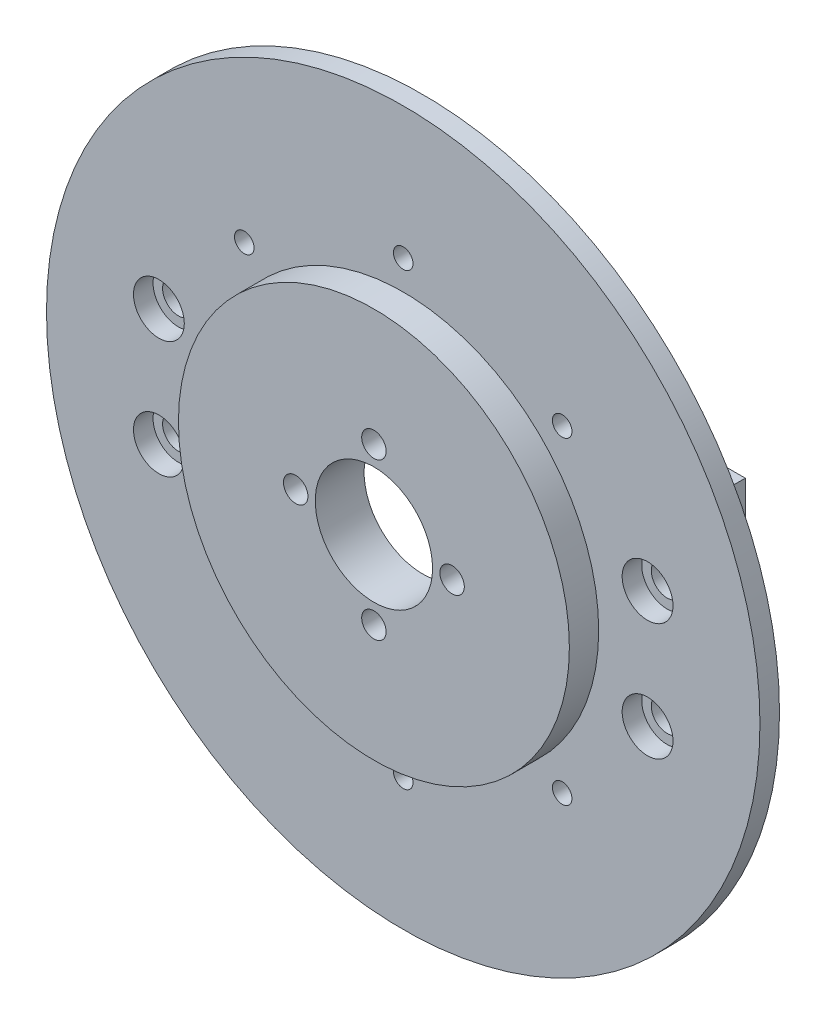
ISO-10303-21;
HEADER;
FILE_DESCRIPTION(('STEP AP214'),'2;1');
FILE_NAME('part.step','',(''),(''),'','','');
FILE_SCHEMA(('AUTOMOTIVE_DESIGN { 1 0 10303 214 1 1 1 1 }'));
ENDSEC;
DATA;
#1=APPLICATION_CONTEXT('core data for automotive mechanical design processes');
#2=APPLICATION_PROTOCOL_DEFINITION('international standard','automotive_design',2000,#1);
#3=PRODUCT_CONTEXT('',#1,'mechanical');
#4=PRODUCT('Part','Part','',(#3));
#5=PRODUCT_RELATED_PRODUCT_CATEGORY('part','',(#4));
#6=PRODUCT_DEFINITION_FORMATION('','',#4);
#7=PRODUCT_DEFINITION_CONTEXT('part definition',#1,'design');
#8=PRODUCT_DEFINITION('design','',#6,#7);
#9=PRODUCT_DEFINITION_SHAPE('','',#8);
#10=(LENGTH_UNIT() NAMED_UNIT(*) SI_UNIT(.MILLI.,.METRE.));
#11=(NAMED_UNIT(*) PLANE_ANGLE_UNIT() SI_UNIT($,.RADIAN.));
#12=(NAMED_UNIT(*) SI_UNIT($,.STERADIAN.) SOLID_ANGLE_UNIT());
#13=UNCERTAINTY_MEASURE_WITH_UNIT(LENGTH_MEASURE(1.E-05),#10,'distance_accuracy_value','');
#14=(GEOMETRIC_REPRESENTATION_CONTEXT(3) GLOBAL_UNCERTAINTY_ASSIGNED_CONTEXT((#13)) GLOBAL_UNIT_ASSIGNED_CONTEXT((#10,
#11,#12)) REPRESENTATION_CONTEXT('',''));
#15=CARTESIAN_POINT('',(0.,0.,0.));
#16=DIRECTION('',(0.,0.,1.));
#17=DIRECTION('',(1.,0.,0.));
#18=AXIS2_PLACEMENT_3D('',#15,#16,#17);
#19=CARTESIAN_POINT('',(0.,0.,0.));
#20=DIRECTION('',(0.,0.,1.));
#21=DIRECTION('',(1.,0.,0.));
#22=AXIS2_PLACEMENT_3D('',#19,#20,#21);
#23=PLANE('',#22);
#24=CARTESIAN_POINT('',(-19.8942699301627,12.0842077999198,0.));
#25=DIRECTION('',(0.,0.,-1.));
#26=DIRECTION('',(-1.,0.,0.));
#27=AXIS2_PLACEMENT_3D('',#24,#25,#26);
#28=CIRCLE('',#27,1.62);
#29=CARTESIAN_POINT('',(-21.5142699301627,12.0842077999198,0.));
#30=VERTEX_POINT('',#29);
#31=EDGE_CURVE('E194',#30,#30,#28,.T.);
#32=ORIENTED_EDGE('',*,*,#31,.F.);
#33=EDGE_LOOP('',(#32));
#34=FACE_BOUND('',#33,.T.);
#35=CARTESIAN_POINT('',(-19.8942699301627,0.0842077999197634,0.));
#36=DIRECTION('',(0.,0.,-1.));
#37=DIRECTION('',(-1.,0.,0.));
#38=AXIS2_PLACEMENT_3D('',#35,#36,#37);
#39=CIRCLE('',#38,1.62);
#40=CARTESIAN_POINT('',(-21.5142699301627,0.0842077999197634,0.));
#41=VERTEX_POINT('',#40);
#42=EDGE_CURVE('E187',#41,#41,#39,.T.);
#43=ORIENTED_EDGE('',*,*,#42,.F.);
#44=EDGE_LOOP('',(#43));
#45=FACE_BOUND('',#44,.T.);
#46=DIRECTION('',(1.,0.,0.));
#47=VECTOR('',#46,1.);
#48=CARTESIAN_POINT('',(-74.8942699301627,-9.91579220008024,0.));
#49=LINE('',#48,#47);
#50=CARTESIAN_POINT('',(-23.6377596918575,-9.91579220008024,0.));
#51=VERTEX_POINT('',#50);
#52=CARTESIAN_POINT('',(-14.8942699301627,-9.91579220008024,0.));
#53=VERTEX_POINT('',#52);
#54=EDGE_CURVE('E156',#51,#53,#49,.T.);
#55=ORIENTED_EDGE('',*,*,#54,.F.);
#56=DIRECTION('',(0.,-1.,0.));
#57=VECTOR('',#56,1.);
#58=CARTESIAN_POINT('',(-23.6377596918575,22.0842077999198,0.));
#59=LINE('',#58,#57);
#60=CARTESIAN_POINT('',(-23.6377596918575,22.0842077999198,0.));
#61=VERTEX_POINT('',#60);
#62=EDGE_CURVE('E122',#61,#51,#59,.T.);
#63=ORIENTED_EDGE('',*,*,#62,.F.);
#64=DIRECTION('',(-1.,0.,0.));
#65=VECTOR('',#64,1.);
#66=CARTESIAN_POINT('',(-74.8942699301627,22.0842077999198,0.));
#67=LINE('',#66,#65);
#68=CARTESIAN_POINT('',(-14.8942699301627,22.0842077999198,0.));
#69=VERTEX_POINT('',#68);
#70=EDGE_CURVE('E145',#69,#61,#67,.T.);
#71=ORIENTED_EDGE('',*,*,#70,.F.);
#72=DIRECTION('',(0.,1.,0.));
#73=VECTOR('',#72,1.);
#74=CARTESIAN_POINT('',(-14.8942699301627,22.0842077999198,0.));
#75=LINE('',#74,#73);
#76=EDGE_CURVE('E74',#53,#69,#75,.T.);
#77=ORIENTED_EDGE('',*,*,#76,.F.);
#78=EDGE_LOOP('',(#55,#63,#71,#77));
#79=FACE_BOUND('',#78,.T.);
#80=ADVANCED_FACE('F39',(#34,#45,#79),#23,.F.);
#81=CARTESIAN_POINT('',(-44.8942699301627,14.0842077999198,-2.));
#82=DIRECTION('',(0.,0.,1.));
#83=DIRECTION('',(1.,0.,0.));
#84=AXIS2_PLACEMENT_3D('',#81,#82,#83);
#85=CYLINDRICAL_SURFACE('',#84,1.25);
#86=CARTESIAN_POINT('',(-44.8942699301627,14.0842077999198,8.));
#87=DIRECTION('',(0.,0.,1.));
#88=DIRECTION('',(1.,0.,0.));
#89=AXIS2_PLACEMENT_3D('',#86,#87,#88);
#90=CIRCLE('',#89,1.25);
#91=CARTESIAN_POINT('',(-43.6442699301627,14.0842077999198,8.));
#92=VERTEX_POINT('',#91);
#93=EDGE_CURVE('E276',#92,#92,#90,.T.);
#94=ORIENTED_EDGE('',*,*,#93,.T.);
#95=EDGE_LOOP('',(#94));
#96=FACE_BOUND('',#95,.T.);
#97=CARTESIAN_POINT('',(-44.8942699301627,14.0842077999198,3.));
#98=DIRECTION('',(0.,0.,-1.));
#99=DIRECTION('',(-1.,0.,0.));
#100=AXIS2_PLACEMENT_3D('',#97,#98,#99);
#101=CIRCLE('',#100,1.25);
#102=CARTESIAN_POINT('',(-46.1442699301627,14.0842077999198,3.));
#103=VERTEX_POINT('',#102);
#104=EDGE_CURVE('E263',#103,#103,#101,.F.);
#105=ORIENTED_EDGE('',*,*,#104,.F.);
#106=EDGE_LOOP('',(#105));
#107=FACE_BOUND('',#106,.T.);
#108=ADVANCED_FACE('F340',(#96,#107),#85,.F.);
#109=CARTESIAN_POINT('',(-36.8942699301627,6.08420779991985,-2.));
#110=DIRECTION('',(0.,0.,1.));
#111=DIRECTION('',(1.,0.,0.));
#112=AXIS2_PLACEMENT_3D('',#109,#110,#111);
#113=CYLINDRICAL_SURFACE('',#112,1.25);
#114=CARTESIAN_POINT('',(-36.8942699301627,6.08420779991985,8.));
#115=DIRECTION('',(0.,0.,1.));
#116=DIRECTION('',(0.,-1.,0.));
#117=AXIS2_PLACEMENT_3D('',#114,#115,#116);
#118=CIRCLE('',#117,1.25);
#119=CARTESIAN_POINT('',(-36.8942699301627,4.83420779991985,8.));
#120=VERTEX_POINT('',#119);
#121=EDGE_CURVE('E265',#120,#120,#118,.T.);
#122=ORIENTED_EDGE('',*,*,#121,.T.);
#123=EDGE_LOOP('',(#122));
#124=FACE_BOUND('',#123,.T.);
#125=CARTESIAN_POINT('',(-36.8942699301627,6.08420779991985,3.));
#126=DIRECTION('',(0.,0.,-1.));
#127=DIRECTION('',(-1.,0.,0.));
#128=AXIS2_PLACEMENT_3D('',#125,#126,#127);
#129=CIRCLE('',#128,1.25);
#130=CARTESIAN_POINT('',(-38.1442699301627,6.08420779991985,3.));
#131=VERTEX_POINT('',#130);
#132=EDGE_CURVE('E260',#131,#131,#129,.F.);
#133=ORIENTED_EDGE('',*,*,#132,.F.);
#134=EDGE_LOOP('',(#133));
#135=FACE_BOUND('',#134,.T.);
#136=ADVANCED_FACE('F346',(#124,#135),#113,.F.);
#137=CARTESIAN_POINT('',(-44.8942699301627,-1.91579220008024,-2.));
#138=DIRECTION('',(0.,0.,1.));
#139=DIRECTION('',(1.,0.,0.));
#140=AXIS2_PLACEMENT_3D('',#137,#138,#139);
#141=CYLINDRICAL_SURFACE('',#140,1.25);
#142=CARTESIAN_POINT('',(-44.8942699301627,-1.91579220008024,8.));
#143=DIRECTION('',(0.,0.,1.));
#144=DIRECTION('',(-1.,0.,0.));
#145=AXIS2_PLACEMENT_3D('',#142,#143,#144);
#146=CIRCLE('',#145,1.25);
#147=CARTESIAN_POINT('',(-46.1442699301627,-1.91579220008024,8.));
#148=VERTEX_POINT('',#147);
#149=EDGE_CURVE('E268',#148,#148,#146,.T.);
#150=ORIENTED_EDGE('',*,*,#149,.T.);
#151=EDGE_LOOP('',(#150));
#152=FACE_BOUND('',#151,.T.);
#153=CARTESIAN_POINT('',(-44.8942699301627,-1.91579220008024,3.));
#154=DIRECTION('',(0.,0.,-1.));
#155=DIRECTION('',(-1.,0.,0.));
#156=AXIS2_PLACEMENT_3D('',#153,#154,#155);
#157=CIRCLE('',#156,1.25);
#158=CARTESIAN_POINT('',(-46.1442699301627,-1.91579220008024,3.));
#159=VERTEX_POINT('',#158);
#160=EDGE_CURVE('E256',#159,#159,#157,.F.);
#161=ORIENTED_EDGE('',*,*,#160,.F.);
#162=EDGE_LOOP('',(#161));
#163=FACE_BOUND('',#162,.T.);
#164=ADVANCED_FACE('F586',(#152,#163),#141,.F.);
#165=CARTESIAN_POINT('',(-52.8942699301627,6.08420779991974,-2.));
#166=DIRECTION('',(0.,0.,1.));
#167=DIRECTION('',(1.,0.,0.));
#168=AXIS2_PLACEMENT_3D('',#165,#166,#167);
#169=CYLINDRICAL_SURFACE('',#168,1.25);
#170=CARTESIAN_POINT('',(-52.8942699301627,6.08420779991974,8.));
#171=DIRECTION('',(0.,0.,1.));
#172=DIRECTION('',(0.,1.,0.));
#173=AXIS2_PLACEMENT_3D('',#170,#171,#172);
#174=CIRCLE('',#173,1.25);
#175=CARTESIAN_POINT('',(-52.8942699301627,7.33420779991973,8.));
#176=VERTEX_POINT('',#175);
#177=EDGE_CURVE('E273',#176,#176,#174,.T.);
#178=ORIENTED_EDGE('',*,*,#177,.T.);
#179=EDGE_LOOP('',(#178));
#180=FACE_BOUND('',#179,.T.);
#181=CARTESIAN_POINT('',(-52.8942699301627,6.08420779991974,3.));
#182=DIRECTION('',(0.,0.,-1.));
#183=DIRECTION('',(-1.,0.,0.));
#184=AXIS2_PLACEMENT_3D('',#181,#182,#183);
#185=CIRCLE('',#184,1.25);
#186=CARTESIAN_POINT('',(-54.1442699301627,6.08420779991974,3.));
#187=VERTEX_POINT('',#186);
#188=EDGE_CURVE('E43',#187,#187,#185,.F.);
#189=ORIENTED_EDGE('',*,*,#188,.F.);
#190=EDGE_LOOP('',(#189));
#191=FACE_BOUND('',#190,.T.);
#192=ADVANCED_FACE('F463',(#180,#191),#169,.F.);
#193=CARTESIAN_POINT('',(-19.8942699301627,12.0842077999198,5.));
#194=DIRECTION('',(0.,0.,-1.));
#195=DIRECTION('',(-1.,0.,0.));
#196=AXIS2_PLACEMENT_3D('',#193,#194,#195);
#197=CYLINDRICAL_SURFACE('',#196,1.62);
#198=ORIENTED_EDGE('',*,*,#31,.T.);
#199=EDGE_LOOP('',(#198));
#200=FACE_BOUND('',#199,.T.);
#201=CARTESIAN_POINT('',(-19.8942699301627,12.0842077999198,3.));
#202=DIRECTION('',(0.,0.,1.));
#203=DIRECTION('',(1.,0.,0.));
#204=AXIS2_PLACEMENT_3D('',#201,#202,#203);
#205=CIRCLE('',#204,1.62);
#206=CARTESIAN_POINT('',(-18.2742699301627,12.0842077999198,3.));
#207=VERTEX_POINT('',#206);
#208=EDGE_CURVE('E176',#207,#207,#205,.F.);
#209=ORIENTED_EDGE('',*,*,#208,.F.);
#210=EDGE_LOOP('',(#209));
#211=FACE_BOUND('',#210,.T.);
#212=ADVANCED_FACE('F452',(#200,#211),#197,.F.);
#213=CARTESIAN_POINT('',(-69.8942699301627,0.0842077999197634,5.));
#214=DIRECTION('',(0.,0.,-1.));
#215=DIRECTION('',(-1.,0.,0.));
#216=AXIS2_PLACEMENT_3D('',#213,#214,#215);
#217=CYLINDRICAL_SURFACE('',#216,1.62);
#218=CARTESIAN_POINT('',(-69.8942699301627,0.0842077999197634,0.));
#219=DIRECTION('',(0.,0.,-1.));
#220=DIRECTION('',(-1.,0.,0.));
#221=AXIS2_PLACEMENT_3D('',#218,#219,#220);
#222=CIRCLE('',#221,1.62);
#223=CARTESIAN_POINT('',(-71.5142699301627,0.0842077999197634,0.));
#224=VERTEX_POINT('',#223);
#225=EDGE_CURVE('E178',#224,#224,#222,.T.);
#226=ORIENTED_EDGE('',*,*,#225,.T.);
#227=EDGE_LOOP('',(#226));
#228=FACE_BOUND('',#227,.T.);
#229=CARTESIAN_POINT('',(-69.8942699301627,0.0842077999197634,3.));
#230=DIRECTION('',(0.,0.,1.));
#231=DIRECTION('',(1.,0.,0.));
#232=AXIS2_PLACEMENT_3D('',#229,#230,#231);
#233=CIRCLE('',#232,1.62);
#234=CARTESIAN_POINT('',(-68.2742699301627,0.0842077999197634,3.));
#235=VERTEX_POINT('',#234);
#236=EDGE_CURVE('E174',#235,#235,#233,.F.);
#237=ORIENTED_EDGE('',*,*,#236,.F.);
#238=EDGE_LOOP('',(#237));
#239=FACE_BOUND('',#238,.T.);
#240=ADVANCED_FACE('F448',(#228,#239),#217,.F.);
#241=CARTESIAN_POINT('',(-69.8942699301627,12.0842077999198,5.));
#242=DIRECTION('',(0.,0.,-1.));
#243=DIRECTION('',(-1.,0.,0.));
#244=AXIS2_PLACEMENT_3D('',#241,#242,#243);
#245=CYLINDRICAL_SURFACE('',#244,1.62);
#246=CARTESIAN_POINT('',(-69.8942699301627,12.0842077999198,0.));
#247=DIRECTION('',(0.,0.,-1.));
#248=DIRECTION('',(-1.,0.,0.));
#249=AXIS2_PLACEMENT_3D('',#246,#247,#248);
#250=CIRCLE('',#249,1.62);
#251=CARTESIAN_POINT('',(-71.5142699301627,12.0842077999198,0.));
#252=VERTEX_POINT('',#251);
#253=EDGE_CURVE('E182',#252,#252,#250,.T.);
#254=ORIENTED_EDGE('',*,*,#253,.T.);
#255=EDGE_LOOP('',(#254));
#256=FACE_BOUND('',#255,.T.);
#257=CARTESIAN_POINT('',(-69.8942699301627,12.0842077999198,3.));
#258=DIRECTION('',(0.,0.,1.));
#259=DIRECTION('',(1.,0.,0.));
#260=AXIS2_PLACEMENT_3D('',#257,#258,#259);
#261=CIRCLE('',#260,1.62);
#262=CARTESIAN_POINT('',(-68.2742699301627,12.0842077999198,3.));
#263=VERTEX_POINT('',#262);
#264=EDGE_CURVE('E170',#263,#263,#261,.F.);
#265=ORIENTED_EDGE('',*,*,#264,.F.);
#266=EDGE_LOOP('',(#265));
#267=FACE_BOUND('',#266,.T.);
#268=ADVANCED_FACE('F451',(#256,#267),#245,.F.);
#269=CARTESIAN_POINT('',(-19.8942699301627,0.0842077999197634,5.));
#270=DIRECTION('',(0.,0.,-1.));
#271=DIRECTION('',(-1.,0.,0.));
#272=AXIS2_PLACEMENT_3D('',#269,#270,#271);
#273=CYLINDRICAL_SURFACE('',#272,1.62);
#274=ORIENTED_EDGE('',*,*,#42,.T.);
#275=EDGE_LOOP('',(#274));
#276=FACE_BOUND('',#275,.T.);
#277=CARTESIAN_POINT('',(-19.8942699301627,0.0842077999197634,3.));
#278=DIRECTION('',(0.,0.,1.));
#279=DIRECTION('',(1.,0.,0.));
#280=AXIS2_PLACEMENT_3D('',#277,#278,#279);
#281=CIRCLE('',#280,1.62);
#282=CARTESIAN_POINT('',(-18.2742699301627,0.0842077999197634,3.));
#283=VERTEX_POINT('',#282);
#284=EDGE_CURVE('E167',#283,#283,#281,.F.);
#285=ORIENTED_EDGE('',*,*,#284,.F.);
#286=EDGE_LOOP('',(#285));
#287=FACE_BOUND('',#286,.T.);
#288=ADVANCED_FACE('F453',(#276,#287),#273,.F.);
#289=CARTESIAN_POINT('',(-61.1577258974533,22.3476637672103,-5.));
#290=DIRECTION('',(0.,0.,1.));
#291=DIRECTION('',(1.,0.,0.));
#292=AXIS2_PLACEMENT_3D('',#289,#290,#291);
#293=CYLINDRICAL_SURFACE('',#292,0.999999999999998);
#294=CARTESIAN_POINT('',(-61.1577258974533,22.3476637672103,5.));
#295=DIRECTION('',(0.,0.,1.));
#296=DIRECTION('',(0.707106781186546,0.707106781186549,0.));
#297=AXIS2_PLACEMENT_3D('',#294,#295,#296);
#298=CIRCLE('',#297,0.999999999999998);
#299=CARTESIAN_POINT('',(-60.4506191162668,23.0547705483969,5.));
#300=VERTEX_POINT('',#299);
#301=EDGE_CURVE('E209',#300,#300,#298,.T.);
#302=ORIENTED_EDGE('',*,*,#301,.T.);
#303=EDGE_LOOP('',(#302));
#304=FACE_BOUND('',#303,.T.);
#305=CARTESIAN_POINT('',(-61.1577258974533,22.3476637672103,3.));
#306=DIRECTION('',(0.,0.,1.));
#307=DIRECTION('',(1.,0.,0.));
#308=AXIS2_PLACEMENT_3D('',#305,#306,#307);
#309=CIRCLE('',#308,0.999999999999998);
#310=CARTESIAN_POINT('',(-60.1577258974533,22.3476637672103,3.));
#311=VERTEX_POINT('',#310);
#312=EDGE_CURVE('E217',#311,#311,#309,.T.);
#313=ORIENTED_EDGE('',*,*,#312,.F.);
#314=EDGE_LOOP('',(#313));
#315=FACE_BOUND('',#314,.T.);
#316=ADVANCED_FACE('F456',(#304,#315),#293,.F.);
#317=CARTESIAN_POINT('',(-28.6308139628723,22.3476637672106,-5.));
#318=DIRECTION('',(0.,0.,1.));
#319=DIRECTION('',(1.,0.,0.));
#320=AXIS2_PLACEMENT_3D('',#317,#318,#319);
#321=CYLINDRICAL_SURFACE('',#320,0.999999999999998);
#322=CARTESIAN_POINT('',(-28.6308139628723,22.3476637672106,5.));
#323=DIRECTION('',(0.,0.,1.));
#324=DIRECTION('',(0.707106781186556,-0.707106781186539,0.));
#325=AXIS2_PLACEMENT_3D('',#322,#323,#324);
#326=CIRCLE('',#325,0.999999999999998);
#327=CARTESIAN_POINT('',(-27.9237071816858,21.640556986024,5.));
#328=VERTEX_POINT('',#327);
#329=EDGE_CURVE('E202',#328,#328,#326,.T.);
#330=ORIENTED_EDGE('',*,*,#329,.T.);
#331=EDGE_LOOP('',(#330));
#332=FACE_BOUND('',#331,.T.);
#333=CARTESIAN_POINT('',(-28.6308139628723,22.3476637672106,3.));
#334=DIRECTION('',(0.,0.,1.));
#335=DIRECTION('',(1.,0.,0.));
#336=AXIS2_PLACEMENT_3D('',#333,#334,#335);
#337=CIRCLE('',#336,0.999999999999998);
#338=CARTESIAN_POINT('',(-27.6308139628723,22.3476637672106,3.));
#339=VERTEX_POINT('',#338);
#340=EDGE_CURVE('E220',#339,#339,#337,.T.);
#341=ORIENTED_EDGE('',*,*,#340,.F.);
#342=EDGE_LOOP('',(#341));
#343=FACE_BOUND('',#342,.T.);
#344=ADVANCED_FACE('F465',(#332,#343),#321,.F.);
#345=CARTESIAN_POINT('',(-28.630813962872,-10.1792481673707,-5.));
#346=DIRECTION('',(0.,0.,1.));
#347=DIRECTION('',(1.,0.,0.));
#348=AXIS2_PLACEMENT_3D('',#345,#346,#347);
#349=CYLINDRICAL_SURFACE('',#348,0.999999999999998);
#350=CARTESIAN_POINT('',(-28.630813962872,-10.1792481673707,5.));
#351=DIRECTION('',(0.,0.,1.));
#352=DIRECTION('',(-0.707106781186541,-0.707106781186554,0.));
#353=AXIS2_PLACEMENT_3D('',#350,#351,#352);
#354=CIRCLE('',#353,0.999999999999998);
#355=CARTESIAN_POINT('',(-29.3379207440585,-10.8863549485572,5.));
#356=VERTEX_POINT('',#355);
#357=EDGE_CURVE('E205',#356,#356,#354,.T.);
#358=ORIENTED_EDGE('',*,*,#357,.T.);
#359=EDGE_LOOP('',(#358));
#360=FACE_BOUND('',#359,.T.);
#361=CARTESIAN_POINT('',(-28.630813962872,-10.1792481673707,3.));
#362=DIRECTION('',(0.,0.,1.));
#363=DIRECTION('',(1.,0.,0.));
#364=AXIS2_PLACEMENT_3D('',#361,#362,#363);
#365=CIRCLE('',#364,0.999999999999998);
#366=CARTESIAN_POINT('',(-27.630813962872,-10.1792481673707,3.));
#367=VERTEX_POINT('',#366);
#368=EDGE_CURVE('E223',#367,#367,#365,.T.);
#369=ORIENTED_EDGE('',*,*,#368,.F.);
#370=EDGE_LOOP('',(#369));
#371=FACE_BOUND('',#370,.T.);
#372=ADVANCED_FACE('F468',(#360,#371),#349,.F.);
#373=CARTESIAN_POINT('',(-61.1577258974532,-10.1792481673709,-5.));
#374=DIRECTION('',(0.,0.,1.));
#375=DIRECTION('',(1.,0.,0.));
#376=AXIS2_PLACEMENT_3D('',#373,#374,#375);
#377=CYLINDRICAL_SURFACE('',#376,0.999999999999998);
#378=CARTESIAN_POINT('',(-61.1577258974532,-10.1792481673709,5.));
#379=DIRECTION('',(0.,0.,1.));
#380=DIRECTION('',(-0.707106781186551,0.707106781186544,0.));
#381=AXIS2_PLACEMENT_3D('',#378,#379,#380);
#382=CIRCLE('',#381,0.999999999999998);
#383=CARTESIAN_POINT('',(-61.8648326786398,-9.47214138618437,5.));
#384=VERTEX_POINT('',#383);
#385=EDGE_CURVE('E206',#384,#384,#382,.T.);
#386=ORIENTED_EDGE('',*,*,#385,.T.);
#387=EDGE_LOOP('',(#386));
#388=FACE_BOUND('',#387,.T.);
#389=CARTESIAN_POINT('',(-61.1577258974532,-10.1792481673709,3.));
#390=DIRECTION('',(0.,0.,1.));
#391=DIRECTION('',(1.,0.,0.));
#392=AXIS2_PLACEMENT_3D('',#389,#390,#391);
#393=CIRCLE('',#392,0.999999999999998);
#394=CARTESIAN_POINT('',(-60.1577258974532,-10.1792481673709,3.));
#395=VERTEX_POINT('',#394);
#396=EDGE_CURVE('E229',#395,#395,#393,.T.);
#397=ORIENTED_EDGE('',*,*,#396,.F.);
#398=EDGE_LOOP('',(#397));
#399=FACE_BOUND('',#398,.T.);
#400=ADVANCED_FACE('F470',(#388,#399),#377,.F.);
#401=CARTESIAN_POINT('',(-74.8942699301627,-9.91579220008024,3.));
#402=DIRECTION('',(0.,1.,0.));
#403=DIRECTION('',(0.,0.,1.));
#404=AXIS2_PLACEMENT_3D('',#401,#402,#403);
#405=PLANE('',#404);
#406=CARTESIAN_POINT('',(-74.8942699301627,-9.91579220008024,0.));
#407=VERTEX_POINT('',#406);
#408=CARTESIAN_POINT('',(-66.150780168468,-9.91579220008024,0.));
#409=VERTEX_POINT('',#408);
#410=EDGE_CURVE('E158',#407,#409,#49,.T.);
#411=ORIENTED_EDGE('',*,*,#410,.T.);
#412=DIRECTION('',(0.,0.,-1.));
#413=VECTOR('',#412,1.);
#414=CARTESIAN_POINT('',(-66.150780168468,-9.91579220008024,3.));
#415=LINE('',#414,#413);
#416=CARTESIAN_POINT('',(-66.150780168468,-9.91579220008024,3.));
#417=VERTEX_POINT('',#416);
#418=EDGE_CURVE('E127',#409,#417,#415,.F.);
#419=ORIENTED_EDGE('',*,*,#418,.T.);
#420=DIRECTION('',(1.,0.,0.));
#421=VECTOR('',#420,1.);
#422=CARTESIAN_POINT('',(-74.8942699301627,-9.91579220008024,3.));
#423=LINE('',#422,#421);
#424=CARTESIAN_POINT('',(-74.8942699301627,-9.91579220008024,3.));
#425=VERTEX_POINT('',#424);
#426=EDGE_CURVE('E86',#425,#417,#423,.T.);
#427=ORIENTED_EDGE('',*,*,#426,.F.);
#428=DIRECTION('',(0.,0.,-1.));
#429=VECTOR('',#428,1.);
#430=CARTESIAN_POINT('',(-74.8942699301627,-9.91579220008024,3.));
#431=LINE('',#430,#429);
#432=EDGE_CURVE('E11',#425,#407,#431,.T.);
#433=ORIENTED_EDGE('',*,*,#432,.T.);
#434=EDGE_LOOP('',(#411,#419,#427,#433));
#435=FACE_BOUND('',#434,.T.);
#436=ADVANCED_FACE('F473',(#435),#405,.F.);
#437=CARTESIAN_POINT('',(-74.8942699301627,22.0842077999198,3.));
#438=DIRECTION('',(0.,-1.,0.));
#439=DIRECTION('',(0.,0.,-1.));
#440=AXIS2_PLACEMENT_3D('',#437,#438,#439);
#441=PLANE('',#440);
#442=ORIENTED_EDGE('',*,*,#70,.T.);
#443=DIRECTION('',(0.,0.,-1.));
#444=VECTOR('',#443,1.);
#445=CARTESIAN_POINT('',(-23.6377596918575,22.0842077999198,3.));
#446=LINE('',#445,#444);
#447=CARTESIAN_POINT('',(-23.6377596918575,22.0842077999198,3.));
#448=VERTEX_POINT('',#447);
#449=EDGE_CURVE('E198',#61,#448,#446,.F.);
#450=ORIENTED_EDGE('',*,*,#449,.T.);
#451=DIRECTION('',(-1.,0.,0.));
#452=VECTOR('',#451,1.);
#453=CARTESIAN_POINT('',(-74.8942699301627,22.0842077999198,3.));
#454=LINE('',#453,#452);
#455=CARTESIAN_POINT('',(-14.8942699301627,22.0842077999198,3.));
#456=VERTEX_POINT('',#455);
#457=EDGE_CURVE('E136',#456,#448,#454,.T.);
#458=ORIENTED_EDGE('',*,*,#457,.F.);
#459=DIRECTION('',(0.,0.,-1.));
#460=VECTOR('',#459,1.);
#461=CARTESIAN_POINT('',(-14.8942699301627,22.0842077999198,3.));
#462=LINE('',#461,#460);
#463=EDGE_CURVE('E58',#456,#69,#462,.T.);
#464=ORIENTED_EDGE('',*,*,#463,.T.);
#465=EDGE_LOOP('',(#442,#450,#458,#464));
#466=FACE_BOUND('',#465,.T.);
#467=ADVANCED_FACE('F360',(#466),#441,.F.);
#468=CARTESIAN_POINT('',(-74.8942699301627,22.0842077999198,3.));
#469=DIRECTION('',(1.,0.,0.));
#470=DIRECTION('',(0.,0.,-1.));
#471=AXIS2_PLACEMENT_3D('',#468,#469,#470);
#472=PLANE('',#471);
#473=DIRECTION('',(0.,-1.,0.));
#474=VECTOR('',#473,1.);
#475=CARTESIAN_POINT('',(-74.8942699301627,22.0842077999198,0.));
#476=LINE('',#475,#474);
#477=CARTESIAN_POINT('',(-74.8942699301627,22.0842077999198,0.));
#478=VERTEX_POINT('',#477);
#479=EDGE_CURVE('E153',#478,#407,#476,.T.);
#480=ORIENTED_EDGE('',*,*,#479,.T.);
#481=ORIENTED_EDGE('',*,*,#432,.F.);
#482=DIRECTION('',(0.,-1.,0.));
#483=VECTOR('',#482,1.);
#484=CARTESIAN_POINT('',(-74.8942699301627,22.0842077999198,3.));
#485=LINE('',#484,#483);
#486=CARTESIAN_POINT('',(-74.8942699301627,22.0842077999198,3.));
#487=VERTEX_POINT('',#486);
#488=EDGE_CURVE('E141',#487,#425,#485,.T.);
#489=ORIENTED_EDGE('',*,*,#488,.F.);
#490=DIRECTION('',(0.,0.,-1.));
#491=VECTOR('',#490,1.);
#492=CARTESIAN_POINT('',(-74.8942699301627,22.0842077999198,3.));
#493=LINE('',#492,#491);
#494=EDGE_CURVE('E152',#487,#478,#493,.T.);
#495=ORIENTED_EDGE('',*,*,#494,.T.);
#496=EDGE_LOOP('',(#480,#481,#489,#495));
#497=FACE_BOUND('',#496,.T.);
#498=ADVANCED_FACE('F41',(#497),#472,.F.);
#499=CARTESIAN_POINT('',(-23.6377596918575,-9.91579220008024,3.));
#500=VERTEX_POINT('',#499);
#501=CARTESIAN_POINT('',(-14.8942699301627,-9.91579220008024,3.));
#502=VERTEX_POINT('',#501);
#503=EDGE_CURVE('E134',#500,#502,#423,.T.);
#504=ORIENTED_EDGE('',*,*,#503,.F.);
#505=DIRECTION('',(0.,0.,-1.));
#506=VECTOR('',#505,1.);
#507=CARTESIAN_POINT('',(-23.6377596918572,-9.91579220008024,3.));
#508=LINE('',#507,#506);
#509=EDGE_CURVE('E116',#500,#51,#508,.T.);
#510=ORIENTED_EDGE('',*,*,#509,.T.);
#511=ORIENTED_EDGE('',*,*,#54,.T.);
#512=DIRECTION('',(0.,0.,-1.));
#513=VECTOR('',#512,1.);
#514=CARTESIAN_POINT('',(-14.8942699301627,-9.91579220008024,3.));
#515=LINE('',#514,#513);
#516=EDGE_CURVE('E49',#502,#53,#515,.T.);
#517=ORIENTED_EDGE('',*,*,#516,.F.);
#518=EDGE_LOOP('',(#504,#510,#511,#517));
#519=FACE_BOUND('',#518,.T.);
#520=ADVANCED_FACE('F140',(#519),#405,.F.);
#521=CARTESIAN_POINT('',(-14.8942699301627,22.0842077999198,3.));
#522=DIRECTION('',(-1.,0.,0.));
#523=DIRECTION('',(0.,-1.,0.));
#524=AXIS2_PLACEMENT_3D('',#521,#522,#523);
#525=PLANE('',#524);
#526=ORIENTED_EDGE('',*,*,#76,.T.);
#527=ORIENTED_EDGE('',*,*,#463,.F.);
#528=DIRECTION('',(0.,1.,0.));
#529=VECTOR('',#528,1.);
#530=CARTESIAN_POINT('',(-14.8942699301627,22.0842077999198,3.));
#531=LINE('',#530,#529);
#532=EDGE_CURVE('E143',#502,#456,#531,.T.);
#533=ORIENTED_EDGE('',*,*,#532,.F.);
#534=ORIENTED_EDGE('',*,*,#516,.T.);
#535=EDGE_LOOP('',(#526,#527,#533,#534));
#536=FACE_BOUND('',#535,.T.);
#537=ADVANCED_FACE('F359',(#536),#525,.F.);
#538=CARTESIAN_POINT('',(-66.1507801684681,22.0842077999198,3.));
#539=VERTEX_POINT('',#538);
#540=EDGE_CURVE('E150',#539,#487,#454,.T.);
#541=ORIENTED_EDGE('',*,*,#540,.F.);
#542=DIRECTION('',(0.,0.,-1.));
#543=VECTOR('',#542,1.);
#544=CARTESIAN_POINT('',(-66.1507801684681,22.0842077999198,3.));
#545=LINE('',#544,#543);
#546=CARTESIAN_POINT('',(-66.150780168468,22.0842077999198,0.));
#547=VERTEX_POINT('',#546);
#548=EDGE_CURVE('E126',#539,#547,#545,.T.);
#549=ORIENTED_EDGE('',*,*,#548,.T.);
#550=EDGE_CURVE('E80',#547,#478,#67,.T.);
#551=ORIENTED_EDGE('',*,*,#550,.T.);
#552=ORIENTED_EDGE('',*,*,#494,.F.);
#553=EDGE_LOOP('',(#541,#549,#551,#552));
#554=FACE_BOUND('',#553,.T.);
#555=ADVANCED_FACE('F353',(#554),#441,.F.);
#556=ORIENTED_EDGE('',*,*,#253,.F.);
#557=EDGE_LOOP('',(#556));
#558=FACE_BOUND('',#557,.T.);
#559=ORIENTED_EDGE('',*,*,#225,.F.);
#560=EDGE_LOOP('',(#559));
#561=FACE_BOUND('',#560,.T.);
#562=ORIENTED_EDGE('',*,*,#550,.F.);
#563=DIRECTION('',(0.,1.,0.));
#564=VECTOR('',#563,1.);
#565=CARTESIAN_POINT('',(-66.150780168468,22.0842077999198,0.));
#566=LINE('',#565,#564);
#567=EDGE_CURVE('E138',#409,#547,#566,.T.);
#568=ORIENTED_EDGE('',*,*,#567,.F.);
#569=ORIENTED_EDGE('',*,*,#410,.F.);
#570=ORIENTED_EDGE('',*,*,#479,.F.);
#571=EDGE_LOOP('',(#562,#568,#569,#570));
#572=FACE_BOUND('',#571,.T.);
#573=ADVANCED_FACE('F247',(#558,#561,#572),#23,.F.);
#574=CARTESIAN_POINT('',(-44.8942699301627,6.08420779991976,3.));
#575=DIRECTION('',(0.,0.,1.));
#576=DIRECTION('',(1.,0.,0.));
#577=AXIS2_PLACEMENT_3D('',#574,#575,#576);
#578=PLANE('',#577);
#579=CARTESIAN_POINT('',(-44.8942699301627,6.08420779991976,3.));
#580=DIRECTION('',(0.,0.,1.));
#581=DIRECTION('',(1.,0.,0.));
#582=AXIS2_PLACEMENT_3D('',#579,#580,#581);
#583=CIRCLE('',#582,6.);
#584=CARTESIAN_POINT('',(-38.8942699301627,6.08420779991976,3.));
#585=VERTEX_POINT('',#584);
#586=EDGE_CURVE('E376',#585,#585,#583,.T.);
#587=ORIENTED_EDGE('',*,*,#586,.T.);
#588=EDGE_LOOP('',(#587));
#589=FACE_BOUND('',#588,.T.);
#590=ORIENTED_EDGE('',*,*,#340,.T.);
#591=EDGE_LOOP('',(#590));
#592=FACE_BOUND('',#591,.T.);
#593=ORIENTED_EDGE('',*,*,#312,.T.);
#594=EDGE_LOOP('',(#593));
#595=FACE_BOUND('',#594,.T.);
#596=DIRECTION('',(0.,1.,0.));
#597=VECTOR('',#596,1.);
#598=CARTESIAN_POINT('',(-66.150780168468,22.0842077999198,3.));
#599=LINE('',#598,#597);
#600=EDGE_CURVE('E137',#417,#539,#599,.T.);
#601=ORIENTED_EDGE('',*,*,#600,.T.);
#602=ORIENTED_EDGE('',*,*,#540,.T.);
#603=ORIENTED_EDGE('',*,*,#488,.T.);
#604=ORIENTED_EDGE('',*,*,#426,.T.);
#605=EDGE_LOOP('',(#601,#602,#603,#604));
#606=FACE_BOUND('',#605,.T.);
#607=ORIENTED_EDGE('',*,*,#396,.T.);
#608=EDGE_LOOP('',(#607));
#609=FACE_BOUND('',#608,.T.);
#610=ORIENTED_EDGE('',*,*,#368,.T.);
#611=EDGE_LOOP('',(#610));
#612=FACE_BOUND('',#611,.T.);
#613=ORIENTED_EDGE('',*,*,#457,.T.);
#614=DIRECTION('',(0.,-1.,0.));
#615=VECTOR('',#614,1.);
#616=CARTESIAN_POINT('',(-23.6377596918575,22.0842077999198,3.));
#617=LINE('',#616,#615);
#618=EDGE_CURVE('E119',#448,#500,#617,.T.);
#619=ORIENTED_EDGE('',*,*,#618,.T.);
#620=ORIENTED_EDGE('',*,*,#503,.T.);
#621=ORIENTED_EDGE('',*,*,#532,.T.);
#622=EDGE_LOOP('',(#613,#619,#620,#621));
#623=FACE_BOUND('',#622,.T.);
#624=CARTESIAN_POINT('',(-44.8942699301627,-16.9157922000802,3.));
#625=DIRECTION('',(0.,0.,1.));
#626=DIRECTION('',(1.,0.,0.));
#627=AXIS2_PLACEMENT_3D('',#624,#625,#626);
#628=CIRCLE('',#627,0.999999999999998);
#629=CARTESIAN_POINT('',(-43.8942699301627,-16.9157922000802,3.));
#630=VERTEX_POINT('',#629);
#631=EDGE_CURVE('E226',#630,#630,#628,.T.);
#632=ORIENTED_EDGE('',*,*,#631,.T.);
#633=EDGE_LOOP('',(#632));
#634=FACE_BOUND('',#633,.T.);
#635=CARTESIAN_POINT('',(-44.8942699301627,29.0842077999198,3.));
#636=DIRECTION('',(0.,0.,1.));
#637=DIRECTION('',(1.,0.,0.));
#638=AXIS2_PLACEMENT_3D('',#635,#636,#637);
#639=CIRCLE('',#638,0.999999999999998);
#640=CARTESIAN_POINT('',(-43.8942699301627,29.0842077999198,3.));
#641=VERTEX_POINT('',#640);
#642=EDGE_CURVE('E235',#641,#641,#639,.T.);
#643=ORIENTED_EDGE('',*,*,#642,.T.);
#644=EDGE_LOOP('',(#643));
#645=FACE_BOUND('',#644,.T.);
#646=CARTESIAN_POINT('',(-44.8942699301627,6.08420779991976,3.));
#647=DIRECTION('',(0.,0.,1.));
#648=DIRECTION('',(1.,0.,0.));
#649=AXIS2_PLACEMENT_3D('',#646,#647,#648);
#650=CIRCLE('',#649,36.5);
#651=CARTESIAN_POINT('',(-8.39426993016271,6.08420779991976,3.));
#652=VERTEX_POINT('',#651);
#653=EDGE_CURVE('E238',#652,#652,#650,.T.);
#654=ORIENTED_EDGE('',*,*,#653,.F.);
#655=EDGE_LOOP('',(#654));
#656=FACE_BOUND('',#655,.T.);
#657=ORIENTED_EDGE('',*,*,#188,.T.);
#658=EDGE_LOOP('',(#657));
#659=FACE_BOUND('',#658,.T.);
#660=ORIENTED_EDGE('',*,*,#160,.T.);
#661=EDGE_LOOP('',(#660));
#662=FACE_BOUND('',#661,.T.);
#663=ORIENTED_EDGE('',*,*,#132,.T.);
#664=EDGE_LOOP('',(#663));
#665=FACE_BOUND('',#664,.T.);
#666=ORIENTED_EDGE('',*,*,#104,.T.);
#667=EDGE_LOOP('',(#666));
#668=FACE_BOUND('',#667,.T.);
#669=ADVANCED_FACE('F131',(#589,#592,#595,#606,#609,#612,#623,#634,#645,#656,#659,#662,#665,
#668),#578,.F.);
#670=CARTESIAN_POINT('',(-44.8942699301627,6.08420779991976,5.));
#671=DIRECTION('',(0.,0.,-1.));
#672=DIRECTION('',(-1.,0.,0.));
#673=AXIS2_PLACEMENT_3D('',#670,#671,#672);
#674=CYLINDRICAL_SURFACE('',#673,36.5);
#675=CARTESIAN_POINT('',(-44.8942699301627,6.08420779991976,5.));
#676=DIRECTION('',(0.,0.,1.));
#677=DIRECTION('',(1.,0.,0.));
#678=AXIS2_PLACEMENT_3D('',#675,#676,#677);
#679=CIRCLE('',#678,36.5);
#680=CARTESIAN_POINT('',(-8.39426993016271,6.08420779991976,5.));
#681=VERTEX_POINT('',#680);
#682=EDGE_CURVE('E157',#681,#681,#679,.T.);
#683=ORIENTED_EDGE('',*,*,#682,.F.);
#684=EDGE_LOOP('',(#683));
#685=FACE_BOUND('',#684,.T.);
#686=ORIENTED_EDGE('',*,*,#653,.T.);
#687=EDGE_LOOP('',(#686));
#688=FACE_BOUND('',#687,.T.);
#689=ADVANCED_FACE('F243',(#685,#688),#674,.T.);
#690=CARTESIAN_POINT('',(-44.8942699301627,6.08420779991976,5.));
#691=DIRECTION('',(0.,0.,1.));
#692=DIRECTION('',(1.,0.,0.));
#693=AXIS2_PLACEMENT_3D('',#690,#691,#692);
#694=PLANE('',#693);
#695=CARTESIAN_POINT('',(-44.8942699301627,6.08420779991976,5.));
#696=DIRECTION('',(0.,0.,1.));
#697=DIRECTION('',(1.,0.,0.));
#698=AXIS2_PLACEMENT_3D('',#695,#696,#697);
#699=CIRCLE('',#698,20.);
#700=CARTESIAN_POINT('',(-24.8942699301627,6.08420779991976,5.));
#701=VERTEX_POINT('',#700);
#702=EDGE_CURVE('E281',#701,#701,#699,.T.);
#703=ORIENTED_EDGE('',*,*,#702,.F.);
#704=EDGE_LOOP('',(#703));
#705=FACE_BOUND('',#704,.T.);
#706=CARTESIAN_POINT('',(-69.8942699301627,0.0842077999197634,5.));
#707=DIRECTION('',(0.,0.,1.));
#708=DIRECTION('',(1.,0.,0.));
#709=AXIS2_PLACEMENT_3D('',#706,#707,#708);
#710=CIRCLE('',#709,2.6);
#711=CARTESIAN_POINT('',(-67.2942699301627,0.0842077999197634,5.));
#712=VERTEX_POINT('',#711);
#713=EDGE_CURVE('E294',#712,#712,#710,.T.);
#714=ORIENTED_EDGE('',*,*,#713,.F.);
#715=EDGE_LOOP('',(#714));
#716=FACE_BOUND('',#715,.T.);
#717=CARTESIAN_POINT('',(-19.8942699301627,12.0842077999198,5.));
#718=DIRECTION('',(0.,0.,1.));
#719=DIRECTION('',(1.,0.,0.));
#720=AXIS2_PLACEMENT_3D('',#717,#718,#719);
#721=CIRCLE('',#720,2.6);
#722=CARTESIAN_POINT('',(-17.2942699301627,12.0842077999198,5.));
#723=VERTEX_POINT('',#722);
#724=EDGE_CURVE('E300',#723,#723,#721,.T.);
#725=ORIENTED_EDGE('',*,*,#724,.F.);
#726=EDGE_LOOP('',(#725));
#727=FACE_BOUND('',#726,.T.);
#728=CARTESIAN_POINT('',(-19.8942699301627,0.0842077999197634,5.));
#729=DIRECTION('',(0.,0.,1.));
#730=DIRECTION('',(1.,0.,0.));
#731=AXIS2_PLACEMENT_3D('',#728,#729,#730);
#732=CIRCLE('',#731,2.6);
#733=CARTESIAN_POINT('',(-17.2942699301627,0.0842077999197634,5.));
#734=VERTEX_POINT('',#733);
#735=EDGE_CURVE('E288',#734,#734,#732,.T.);
#736=ORIENTED_EDGE('',*,*,#735,.F.);
#737=EDGE_LOOP('',(#736));
#738=FACE_BOUND('',#737,.T.);
#739=CARTESIAN_POINT('',(-69.8942699301627,12.0842077999198,5.));
#740=DIRECTION('',(0.,0.,1.));
#741=DIRECTION('',(1.,0.,0.));
#742=AXIS2_PLACEMENT_3D('',#739,#740,#741);
#743=CIRCLE('',#742,2.6);
#744=CARTESIAN_POINT('',(-67.2942699301627,12.0842077999198,5.));
#745=VERTEX_POINT('',#744);
#746=EDGE_CURVE('E191',#745,#745,#743,.T.);
#747=ORIENTED_EDGE('',*,*,#746,.F.);
#748=EDGE_LOOP('',(#747));
#749=FACE_BOUND('',#748,.T.);
#750=ORIENTED_EDGE('',*,*,#385,.F.);
#751=EDGE_LOOP('',(#750));
#752=FACE_BOUND('',#751,.T.);
#753=CARTESIAN_POINT('',(-44.8942699301627,-16.9157922000802,5.));
#754=DIRECTION('',(0.,0.,1.));
#755=DIRECTION('',(-1.,0.,0.));
#756=AXIS2_PLACEMENT_3D('',#753,#754,#755);
#757=CIRCLE('',#756,0.999999999999998);
#758=CARTESIAN_POINT('',(-45.8942699301627,-16.9157922000802,5.));
#759=VERTEX_POINT('',#758);
#760=EDGE_CURVE('E210',#759,#759,#757,.T.);
#761=ORIENTED_EDGE('',*,*,#760,.F.);
#762=EDGE_LOOP('',(#761));
#763=FACE_BOUND('',#762,.T.);
#764=ORIENTED_EDGE('',*,*,#357,.F.);
#765=EDGE_LOOP('',(#764));
#766=FACE_BOUND('',#765,.T.);
#767=ORIENTED_EDGE('',*,*,#329,.F.);
#768=EDGE_LOOP('',(#767));
#769=FACE_BOUND('',#768,.T.);
#770=ORIENTED_EDGE('',*,*,#301,.F.);
#771=EDGE_LOOP('',(#770));
#772=FACE_BOUND('',#771,.T.);
#773=CARTESIAN_POINT('',(-44.8942699301627,29.0842077999198,5.));
#774=DIRECTION('',(0.,0.,1.));
#775=DIRECTION('',(1.,0.,0.));
#776=AXIS2_PLACEMENT_3D('',#773,#774,#775);
#777=CIRCLE('',#776,0.999999999999998);
#778=CARTESIAN_POINT('',(-43.8942699301627,29.0842077999198,5.));
#779=VERTEX_POINT('',#778);
#780=EDGE_CURVE('E232',#779,#779,#777,.T.);
#781=ORIENTED_EDGE('',*,*,#780,.F.);
#782=EDGE_LOOP('',(#781));
#783=FACE_BOUND('',#782,.T.);
#784=ORIENTED_EDGE('',*,*,#682,.T.);
#785=EDGE_LOOP('',(#784));
#786=FACE_BOUND('',#785,.T.);
#787=ADVANCED_FACE('F312',(#705,#716,#727,#738,#749,#752,#763,#766,#769,#772,#783,#786),#694,.T.);
#788=CARTESIAN_POINT('',(-44.8942699301627,29.0842077999198,-5.));
#789=DIRECTION('',(0.,0.,1.));
#790=DIRECTION('',(1.,0.,0.));
#791=AXIS2_PLACEMENT_3D('',#788,#789,#790);
#792=CYLINDRICAL_SURFACE('',#791,0.999999999999998);
#793=ORIENTED_EDGE('',*,*,#780,.T.);
#794=EDGE_LOOP('',(#793));
#795=FACE_BOUND('',#794,.T.);
#796=ORIENTED_EDGE('',*,*,#642,.F.);
#797=EDGE_LOOP('',(#796));
#798=FACE_BOUND('',#797,.T.);
#799=ADVANCED_FACE('F315',(#795,#798),#792,.F.);
#800=CARTESIAN_POINT('',(-44.8942699301627,-16.9157922000802,-5.));
#801=DIRECTION('',(0.,0.,1.));
#802=DIRECTION('',(1.,0.,0.));
#803=AXIS2_PLACEMENT_3D('',#800,#801,#802);
#804=CYLINDRICAL_SURFACE('',#803,0.999999999999998);
#805=ORIENTED_EDGE('',*,*,#760,.T.);
#806=EDGE_LOOP('',(#805));
#807=FACE_BOUND('',#806,.T.);
#808=ORIENTED_EDGE('',*,*,#631,.F.);
#809=EDGE_LOOP('',(#808));
#810=FACE_BOUND('',#809,.T.);
#811=ADVANCED_FACE('F425',(#807,#810),#804,.F.);
#812=CARTESIAN_POINT('',(-19.8942699301627,0.0842077999197634,3.));
#813=DIRECTION('',(0.,0.,1.));
#814=DIRECTION('',(1.,0.,0.));
#815=AXIS2_PLACEMENT_3D('',#812,#813,#814);
#816=PLANE('',#815);
#817=CARTESIAN_POINT('',(-19.8942699301627,0.0842077999197634,3.));
#818=DIRECTION('',(0.,0.,1.));
#819=DIRECTION('',(1.,0.,0.));
#820=AXIS2_PLACEMENT_3D('',#817,#818,#819);
#821=CIRCLE('',#820,2.6);
#822=CARTESIAN_POINT('',(-17.2942699301627,0.0842077999197634,3.));
#823=VERTEX_POINT('',#822);
#824=EDGE_CURVE('E285',#823,#823,#821,.T.);
#825=ORIENTED_EDGE('',*,*,#824,.T.);
#826=EDGE_LOOP('',(#825));
#827=FACE_BOUND('',#826,.T.);
#828=ORIENTED_EDGE('',*,*,#284,.T.);
#829=EDGE_LOOP('',(#828));
#830=FACE_BOUND('',#829,.T.);
#831=ADVANCED_FACE('F417',(#827,#830),#816,.T.);
#832=CARTESIAN_POINT('',(-19.8942699301627,0.0842077999197634,3.));
#833=DIRECTION('',(0.,0.,1.));
#834=DIRECTION('',(1.,0.,0.));
#835=AXIS2_PLACEMENT_3D('',#832,#833,#834);
#836=CYLINDRICAL_SURFACE('',#835,2.6);
#837=ORIENTED_EDGE('',*,*,#824,.F.);
#838=EDGE_LOOP('',(#837));
#839=FACE_BOUND('',#838,.T.);
#840=ORIENTED_EDGE('',*,*,#735,.T.);
#841=EDGE_LOOP('',(#840));
#842=FACE_BOUND('',#841,.T.);
#843=ADVANCED_FACE('F414',(#839,#842),#836,.F.);
#844=CARTESIAN_POINT('',(-69.8942699301627,12.0842077999198,3.));
#845=DIRECTION('',(0.,0.,1.));
#846=DIRECTION('',(1.,0.,0.));
#847=AXIS2_PLACEMENT_3D('',#844,#845,#846);
#848=PLANE('',#847);
#849=CARTESIAN_POINT('',(-69.8942699301627,12.0842077999198,3.));
#850=DIRECTION('',(0.,0.,1.));
#851=DIRECTION('',(1.,0.,0.));
#852=AXIS2_PLACEMENT_3D('',#849,#850,#851);
#853=CIRCLE('',#852,2.6);
#854=CARTESIAN_POINT('',(-67.2942699301627,12.0842077999198,3.));
#855=VERTEX_POINT('',#854);
#856=EDGE_CURVE('E171',#855,#855,#853,.T.);
#857=ORIENTED_EDGE('',*,*,#856,.T.);
#858=EDGE_LOOP('',(#857));
#859=FACE_BOUND('',#858,.T.);
#860=ORIENTED_EDGE('',*,*,#264,.T.);
#861=EDGE_LOOP('',(#860));
#862=FACE_BOUND('',#861,.T.);
#863=ADVANCED_FACE('F416',(#859,#862),#848,.T.);
#864=CARTESIAN_POINT('',(-69.8942699301627,12.0842077999198,3.));
#865=DIRECTION('',(0.,0.,1.));
#866=DIRECTION('',(1.,0.,0.));
#867=AXIS2_PLACEMENT_3D('',#864,#865,#866);
#868=CYLINDRICAL_SURFACE('',#867,2.6);
#869=ORIENTED_EDGE('',*,*,#856,.F.);
#870=EDGE_LOOP('',(#869));
#871=FACE_BOUND('',#870,.T.);
#872=ORIENTED_EDGE('',*,*,#746,.T.);
#873=EDGE_LOOP('',(#872));
#874=FACE_BOUND('',#873,.T.);
#875=ADVANCED_FACE('F310',(#871,#874),#868,.F.);
#876=CARTESIAN_POINT('',(-69.8942699301627,0.0842077999197634,3.));
#877=DIRECTION('',(0.,0.,1.));
#878=DIRECTION('',(1.,0.,0.));
#879=AXIS2_PLACEMENT_3D('',#876,#877,#878);
#880=PLANE('',#879);
#881=CARTESIAN_POINT('',(-69.8942699301627,0.0842077999197634,3.));
#882=DIRECTION('',(0.,0.,1.));
#883=DIRECTION('',(1.,0.,0.));
#884=AXIS2_PLACEMENT_3D('',#881,#882,#883);
#885=CIRCLE('',#884,2.6);
#886=CARTESIAN_POINT('',(-67.2942699301627,0.0842077999197634,3.));
#887=VERTEX_POINT('',#886);
#888=EDGE_CURVE('E297',#887,#887,#885,.T.);
#889=ORIENTED_EDGE('',*,*,#888,.T.);
#890=EDGE_LOOP('',(#889));
#891=FACE_BOUND('',#890,.T.);
#892=ORIENTED_EDGE('',*,*,#236,.T.);
#893=EDGE_LOOP('',(#892));
#894=FACE_BOUND('',#893,.T.);
#895=ADVANCED_FACE('F434',(#891,#894),#880,.T.);
#896=CARTESIAN_POINT('',(-69.8942699301627,0.0842077999197634,3.));
#897=DIRECTION('',(0.,0.,1.));
#898=DIRECTION('',(1.,0.,0.));
#899=AXIS2_PLACEMENT_3D('',#896,#897,#898);
#900=CYLINDRICAL_SURFACE('',#899,2.6);
#901=ORIENTED_EDGE('',*,*,#888,.F.);
#902=EDGE_LOOP('',(#901));
#903=FACE_BOUND('',#902,.T.);
#904=ORIENTED_EDGE('',*,*,#713,.T.);
#905=EDGE_LOOP('',(#904));
#906=FACE_BOUND('',#905,.T.);
#907=ADVANCED_FACE('F430',(#903,#906),#900,.F.);
#908=CARTESIAN_POINT('',(-19.8942699301627,12.0842077999198,3.));
#909=DIRECTION('',(0.,0.,1.));
#910=DIRECTION('',(1.,0.,0.));
#911=AXIS2_PLACEMENT_3D('',#908,#909,#910);
#912=PLANE('',#911);
#913=CARTESIAN_POINT('',(-19.8942699301627,12.0842077999198,3.));
#914=DIRECTION('',(0.,0.,1.));
#915=DIRECTION('',(1.,0.,0.));
#916=AXIS2_PLACEMENT_3D('',#913,#914,#915);
#917=CIRCLE('',#916,2.6);
#918=CARTESIAN_POINT('',(-17.2942699301627,12.0842077999198,3.));
#919=VERTEX_POINT('',#918);
#920=EDGE_CURVE('E291',#919,#919,#917,.T.);
#921=ORIENTED_EDGE('',*,*,#920,.T.);
#922=EDGE_LOOP('',(#921));
#923=FACE_BOUND('',#922,.T.);
#924=ORIENTED_EDGE('',*,*,#208,.T.);
#925=EDGE_LOOP('',(#924));
#926=FACE_BOUND('',#925,.T.);
#927=ADVANCED_FACE('F433',(#923,#926),#912,.T.);
#928=CARTESIAN_POINT('',(-19.8942699301627,12.0842077999198,3.));
#929=DIRECTION('',(0.,0.,1.));
#930=DIRECTION('',(1.,0.,0.));
#931=AXIS2_PLACEMENT_3D('',#928,#929,#930);
#932=CYLINDRICAL_SURFACE('',#931,2.6);
#933=ORIENTED_EDGE('',*,*,#920,.F.);
#934=EDGE_LOOP('',(#933));
#935=FACE_BOUND('',#934,.T.);
#936=ORIENTED_EDGE('',*,*,#724,.T.);
#937=EDGE_LOOP('',(#936));
#938=FACE_BOUND('',#937,.T.);
#939=ADVANCED_FACE('F404',(#935,#938),#932,.F.);
#940=CARTESIAN_POINT('',(-44.8942699301627,6.08420779991976,8.));
#941=DIRECTION('',(0.,0.,-1.));
#942=DIRECTION('',(-1.,0.,0.));
#943=AXIS2_PLACEMENT_3D('',#940,#941,#942);
#944=CYLINDRICAL_SURFACE('',#943,20.);
#945=CARTESIAN_POINT('',(-44.8942699301627,6.08420779991976,8.));
#946=DIRECTION('',(0.,0.,1.));
#947=DIRECTION('',(1.,0.,0.));
#948=AXIS2_PLACEMENT_3D('',#945,#946,#947);
#949=CIRCLE('',#948,20.);
#950=CARTESIAN_POINT('',(-24.8942699301627,6.08420779991976,8.));
#951=VERTEX_POINT('',#950);
#952=EDGE_CURVE('E282',#951,#951,#949,.T.);
#953=ORIENTED_EDGE('',*,*,#952,.F.);
#954=EDGE_LOOP('',(#953));
#955=FACE_BOUND('',#954,.T.);
#956=ORIENTED_EDGE('',*,*,#702,.T.);
#957=EDGE_LOOP('',(#956));
#958=FACE_BOUND('',#957,.T.);
#959=ADVANCED_FACE('F391',(#955,#958),#944,.T.);
#960=CARTESIAN_POINT('',(-44.8942699301627,6.08420779991976,8.));
#961=DIRECTION('',(0.,0.,1.));
#962=DIRECTION('',(1.,0.,0.));
#963=AXIS2_PLACEMENT_3D('',#960,#961,#962);
#964=PLANE('',#963);
#965=CARTESIAN_POINT('',(-44.8942699301627,6.08420779991976,8.));
#966=DIRECTION('',(0.,0.,1.));
#967=DIRECTION('',(1.,0.,0.));
#968=AXIS2_PLACEMENT_3D('',#965,#966,#967);
#969=CIRCLE('',#968,6.);
#970=CARTESIAN_POINT('',(-38.8942699301627,6.08420779991976,8.));
#971=VERTEX_POINT('',#970);
#972=EDGE_CURVE('E381',#971,#971,#969,.T.);
#973=ORIENTED_EDGE('',*,*,#972,.F.);
#974=EDGE_LOOP('',(#973));
#975=FACE_BOUND('',#974,.T.);
#976=ORIENTED_EDGE('',*,*,#177,.F.);
#977=EDGE_LOOP('',(#976));
#978=FACE_BOUND('',#977,.T.);
#979=ORIENTED_EDGE('',*,*,#149,.F.);
#980=EDGE_LOOP('',(#979));
#981=FACE_BOUND('',#980,.T.);
#982=ORIENTED_EDGE('',*,*,#121,.F.);
#983=EDGE_LOOP('',(#982));
#984=FACE_BOUND('',#983,.T.);
#985=ORIENTED_EDGE('',*,*,#93,.F.);
#986=EDGE_LOOP('',(#985));
#987=FACE_BOUND('',#986,.T.);
#988=ORIENTED_EDGE('',*,*,#952,.T.);
#989=EDGE_LOOP('',(#988));
#990=FACE_BOUND('',#989,.T.);
#991=ADVANCED_FACE('F388',(#975,#978,#981,#984,#987,#990),#964,.T.);
#992=CARTESIAN_POINT('',(-23.6377596918575,22.0842077999198,3.));
#993=DIRECTION('',(1.,0.,0.));
#994=DIRECTION('',(0.,0.,-1.));
#995=AXIS2_PLACEMENT_3D('',#992,#993,#994);
#996=PLANE('',#995);
#997=ORIENTED_EDGE('',*,*,#62,.T.);
#998=ORIENTED_EDGE('',*,*,#509,.F.);
#999=ORIENTED_EDGE('',*,*,#618,.F.);
#1000=ORIENTED_EDGE('',*,*,#449,.F.);
#1001=EDGE_LOOP('',(#997,#998,#999,#1000));
#1002=FACE_BOUND('',#1001,.T.);
#1003=ADVANCED_FACE('F118',(#1002),#996,.F.);
#1004=CARTESIAN_POINT('',(-66.150780168468,22.0842077999198,3.));
#1005=DIRECTION('',(-1.,0.,0.));
#1006=DIRECTION('',(0.,0.,1.));
#1007=AXIS2_PLACEMENT_3D('',#1004,#1005,#1006);
#1008=PLANE('',#1007);
#1009=ORIENTED_EDGE('',*,*,#567,.T.);
#1010=ORIENTED_EDGE('',*,*,#548,.F.);
#1011=ORIENTED_EDGE('',*,*,#600,.F.);
#1012=ORIENTED_EDGE('',*,*,#418,.F.);
#1013=EDGE_LOOP('',(#1009,#1010,#1011,#1012));
#1014=FACE_BOUND('',#1013,.T.);
#1015=ADVANCED_FACE('F374',(#1014),#1008,.F.);
#1016=CARTESIAN_POINT('',(-44.8942699301627,6.08420779991976,-2.));
#1017=DIRECTION('',(0.,0.,1.));
#1018=DIRECTION('',(1.,0.,0.));
#1019=AXIS2_PLACEMENT_3D('',#1016,#1017,#1018);
#1020=CYLINDRICAL_SURFACE('',#1019,6.);
#1021=ORIENTED_EDGE('',*,*,#972,.T.);
#1022=EDGE_LOOP('',(#1021));
#1023=FACE_BOUND('',#1022,.T.);
#1024=ORIENTED_EDGE('',*,*,#586,.F.);
#1025=EDGE_LOOP('',(#1024));
#1026=FACE_BOUND('',#1025,.T.);
#1027=ADVANCED_FACE('F385',(#1023,#1026),#1020,.F.);
#1028=CLOSED_SHELL('',(#80,#108,#136,#164,#192,#212,#240,#268,#288,#316,#344,#372,#400,#436,
#467,#498,#520,#537,#555,#573,#669,#689,#787,#799,#811,#831,#843,#863,#875,#895,#907,#927,#939,
#959,#991,#1003,#1015,#1027));
#1029=MANIFOLD_SOLID_BREP('B2',#1028);
#1030=ADVANCED_BREP_SHAPE_REPRESENTATION('',(#18,#1029),#14);
#1031=SHAPE_DEFINITION_REPRESENTATION(#9,#1030);
ENDSEC;
END-ISO-10303-21;
